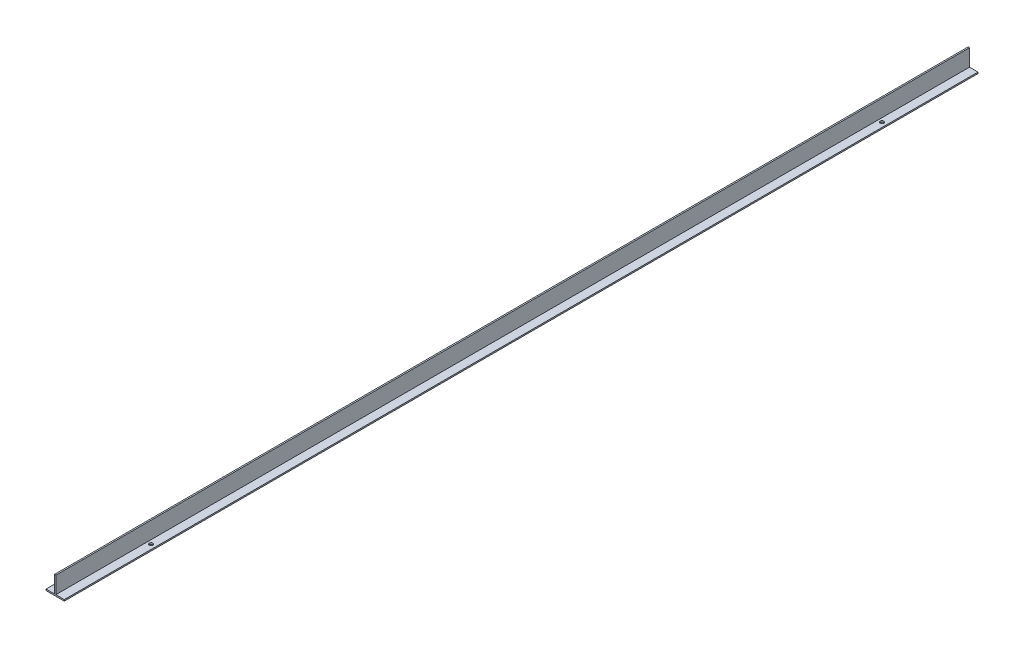
ISO-10303-21;
HEADER;
FILE_DESCRIPTION(('STEP AP214'),'2;1');
FILE_NAME('part.step','',(''),(''),'','','');
FILE_SCHEMA(('AUTOMOTIVE_DESIGN { 1 0 10303 214 1 1 1 1 }'));
ENDSEC;
DATA;
#1=APPLICATION_CONTEXT('core data for automotive mechanical design processes');
#2=APPLICATION_PROTOCOL_DEFINITION('international standard','automotive_design',2000,#1);
#3=PRODUCT_CONTEXT('',#1,'mechanical');
#4=PRODUCT('Part','Part','',(#3));
#5=PRODUCT_RELATED_PRODUCT_CATEGORY('part','',(#4));
#6=PRODUCT_DEFINITION_FORMATION('','',#4);
#7=PRODUCT_DEFINITION_CONTEXT('part definition',#1,'design');
#8=PRODUCT_DEFINITION('design','',#6,#7);
#9=PRODUCT_DEFINITION_SHAPE('','',#8);
#10=(LENGTH_UNIT() NAMED_UNIT(*) SI_UNIT(.MILLI.,.METRE.));
#11=(NAMED_UNIT(*) PLANE_ANGLE_UNIT() SI_UNIT($,.RADIAN.));
#12=(NAMED_UNIT(*) SI_UNIT($,.STERADIAN.) SOLID_ANGLE_UNIT());
#13=UNCERTAINTY_MEASURE_WITH_UNIT(LENGTH_MEASURE(1.E-05),#10,'distance_accuracy_value','');
#14=(GEOMETRIC_REPRESENTATION_CONTEXT(3) GLOBAL_UNCERTAINTY_ASSIGNED_CONTEXT((#13)) GLOBAL_UNIT_ASSIGNED_CONTEXT((#10,
#11,#12)) REPRESENTATION_CONTEXT('',''));
#15=CARTESIAN_POINT('',(0.,0.,0.));
#16=DIRECTION('',(0.,0.,1.));
#17=DIRECTION('',(1.,0.,0.));
#18=AXIS2_PLACEMENT_3D('',#15,#16,#17);
#19=CARTESIAN_POINT('',(10.,1.5,1000.));
#20=DIRECTION('',(-1.,0.,0.));
#21=DIRECTION('',(0.,0.,1.));
#22=AXIS2_PLACEMENT_3D('',#19,#20,#21);
#23=PLANE('',#22);
#24=DIRECTION('',(0.,1.,0.));
#25=VECTOR('',#24,1.);
#26=CARTESIAN_POINT('',(10.,1.5,0.));
#27=LINE('',#26,#25);
#28=CARTESIAN_POINT('',(10.,0.,0.));
#29=VERTEX_POINT('',#28);
#30=CARTESIAN_POINT('',(10.,1.5,0.));
#31=VERTEX_POINT('',#30);
#32=EDGE_CURVE('E132',#29,#31,#27,.T.);
#33=ORIENTED_EDGE('',*,*,#32,.T.);
#34=DIRECTION('',(0.,0.,-1.));
#35=VECTOR('',#34,1.);
#36=CARTESIAN_POINT('',(10.,1.5,1000.));
#37=LINE('',#36,#35);
#38=CARTESIAN_POINT('',(10.,1.5,1000.));
#39=VERTEX_POINT('',#38);
#40=EDGE_CURVE('E11',#39,#31,#37,.T.);
#41=ORIENTED_EDGE('',*,*,#40,.F.);
#42=DIRECTION('',(0.,1.,0.));
#43=VECTOR('',#42,1.);
#44=CARTESIAN_POINT('',(10.,1.5,1000.));
#45=LINE('',#44,#43);
#46=CARTESIAN_POINT('',(10.,0.,1000.));
#47=VERTEX_POINT('',#46);
#48=EDGE_CURVE('E147',#47,#39,#45,.T.);
#49=ORIENTED_EDGE('',*,*,#48,.F.);
#50=DIRECTION('',(0.,0.,-1.));
#51=VECTOR('',#50,1.);
#52=CARTESIAN_POINT('',(10.,0.,1000.));
#53=LINE('',#52,#51);
#54=EDGE_CURVE('E128',#47,#29,#53,.T.);
#55=ORIENTED_EDGE('',*,*,#54,.T.);
#56=EDGE_LOOP('',(#33,#41,#49,#55));
#57=FACE_BOUND('',#56,.T.);
#58=ADVANCED_FACE('F36',(#57),#23,.F.);
#59=CARTESIAN_POINT('',(0.749999999999998,1.5,1000.));
#60=DIRECTION('',(0.,-1.,0.));
#61=DIRECTION('',(1.,0.,0.));
#62=AXIS2_PLACEMENT_3D('',#59,#60,#61);
#63=PLANE('',#62);
#64=CARTESIAN_POINT('',(5.,1.5,100.));
#65=DIRECTION('',(0.,-1.,0.));
#66=DIRECTION('',(1.,0.,0.));
#67=AXIS2_PLACEMENT_3D('',#64,#65,#66);
#68=CIRCLE('',#67,2.00000000000001);
#69=CARTESIAN_POINT('',(7.,1.5,100.));
#70=VERTEX_POINT('',#69);
#71=EDGE_CURVE('E182',#70,#70,#68,.T.);
#72=ORIENTED_EDGE('',*,*,#71,.T.);
#73=EDGE_LOOP('',(#72));
#74=FACE_BOUND('',#73,.T.);
#75=CARTESIAN_POINT('',(5.,1.5,900.));
#76=DIRECTION('',(0.,-1.,0.));
#77=DIRECTION('',(1.,0.,0.));
#78=AXIS2_PLACEMENT_3D('',#75,#76,#77);
#79=CIRCLE('',#78,2.00000000000001);
#80=CARTESIAN_POINT('',(7.,1.5,900.));
#81=VERTEX_POINT('',#80);
#82=EDGE_CURVE('E188',#81,#81,#79,.T.);
#83=ORIENTED_EDGE('',*,*,#82,.T.);
#84=EDGE_LOOP('',(#83));
#85=FACE_BOUND('',#84,.T.);
#86=DIRECTION('',(-1.,0.,0.));
#87=VECTOR('',#86,1.);
#88=CARTESIAN_POINT('',(0.749999999999998,1.5,0.));
#89=LINE('',#88,#87);
#90=CARTESIAN_POINT('',(0.749999999999998,1.5,0.));
#91=VERTEX_POINT('',#90);
#92=EDGE_CURVE('E135',#31,#91,#89,.T.);
#93=ORIENTED_EDGE('',*,*,#92,.T.);
#94=DIRECTION('',(0.,0.,-1.));
#95=VECTOR('',#94,1.);
#96=CARTESIAN_POINT('',(0.749999999999998,1.5,1000.));
#97=LINE('',#96,#95);
#98=CARTESIAN_POINT('',(0.749999999999998,1.5,1000.));
#99=VERTEX_POINT('',#98);
#100=EDGE_CURVE('E44',#99,#91,#97,.T.);
#101=ORIENTED_EDGE('',*,*,#100,.F.);
#102=DIRECTION('',(-1.,0.,0.));
#103=VECTOR('',#102,1.);
#104=CARTESIAN_POINT('',(0.749999999999998,1.5,1000.));
#105=LINE('',#104,#103);
#106=EDGE_CURVE('E95',#39,#99,#105,.T.);
#107=ORIENTED_EDGE('',*,*,#106,.F.);
#108=ORIENTED_EDGE('',*,*,#40,.T.);
#109=EDGE_LOOP('',(#93,#101,#107,#108));
#110=FACE_BOUND('',#109,.T.);
#111=ADVANCED_FACE('F220',(#74,#85,#110),#63,.F.);
#112=CARTESIAN_POINT('',(0.75,20.,1000.));
#113=DIRECTION('',(-1.,0.,0.));
#114=DIRECTION('',(0.,-1.,0.));
#115=AXIS2_PLACEMENT_3D('',#112,#113,#114);
#116=PLANE('',#115);
#117=DIRECTION('',(0.,1.,0.));
#118=VECTOR('',#117,1.);
#119=CARTESIAN_POINT('',(0.75,20.,0.));
#120=LINE('',#119,#118);
#121=CARTESIAN_POINT('',(0.75,20.,0.));
#122=VERTEX_POINT('',#121);
#123=EDGE_CURVE('E138',#91,#122,#120,.T.);
#124=ORIENTED_EDGE('',*,*,#123,.T.);
#125=DIRECTION('',(0.,0.,-1.));
#126=VECTOR('',#125,1.);
#127=CARTESIAN_POINT('',(0.75,20.,1000.));
#128=LINE('',#127,#126);
#129=CARTESIAN_POINT('',(0.75,20.,1000.));
#130=VERTEX_POINT('',#129);
#131=EDGE_CURVE('E154',#130,#122,#128,.T.);
#132=ORIENTED_EDGE('',*,*,#131,.F.);
#133=DIRECTION('',(0.,1.,0.));
#134=VECTOR('',#133,1.);
#135=CARTESIAN_POINT('',(0.75,20.,1000.));
#136=LINE('',#135,#134);
#137=EDGE_CURVE('E162',#99,#130,#136,.T.);
#138=ORIENTED_EDGE('',*,*,#137,.F.);
#139=ORIENTED_EDGE('',*,*,#100,.T.);
#140=EDGE_LOOP('',(#124,#132,#138,#139));
#141=FACE_BOUND('',#140,.T.);
#142=ADVANCED_FACE('F160',(#141),#116,.F.);
#143=CARTESIAN_POINT('',(0.75,20.,1000.));
#144=DIRECTION('',(0.,-1.,0.));
#145=DIRECTION('',(0.,0.,-1.));
#146=AXIS2_PLACEMENT_3D('',#143,#144,#145);
#147=PLANE('',#146);
#148=DIRECTION('',(-1.,0.,0.));
#149=VECTOR('',#148,1.);
#150=CARTESIAN_POINT('',(0.75,20.,0.));
#151=LINE('',#150,#149);
#152=CARTESIAN_POINT('',(-0.75,20.,0.));
#153=VERTEX_POINT('',#152);
#154=EDGE_CURVE('E140',#122,#153,#151,.T.);
#155=ORIENTED_EDGE('',*,*,#154,.T.);
#156=DIRECTION('',(0.,0.,-1.));
#157=VECTOR('',#156,1.);
#158=CARTESIAN_POINT('',(-0.75,20.,1000.));
#159=LINE('',#158,#157);
#160=CARTESIAN_POINT('',(-0.75,20.,1000.));
#161=VERTEX_POINT('',#160);
#162=EDGE_CURVE('E151',#161,#153,#159,.T.);
#163=ORIENTED_EDGE('',*,*,#162,.F.);
#164=DIRECTION('',(-1.,0.,0.));
#165=VECTOR('',#164,1.);
#166=CARTESIAN_POINT('',(0.75,20.,1000.));
#167=LINE('',#166,#165);
#168=EDGE_CURVE('E174',#130,#161,#167,.T.);
#169=ORIENTED_EDGE('',*,*,#168,.F.);
#170=ORIENTED_EDGE('',*,*,#131,.T.);
#171=EDGE_LOOP('',(#155,#163,#169,#170));
#172=FACE_BOUND('',#171,.T.);
#173=ADVANCED_FACE('F170',(#172),#147,.F.);
#174=CARTESIAN_POINT('',(-0.75,20.,1000.));
#175=DIRECTION('',(1.,0.,0.));
#176=DIRECTION('',(0.,1.,0.));
#177=AXIS2_PLACEMENT_3D('',#174,#175,#176);
#178=PLANE('',#177);
#179=DIRECTION('',(0.,-1.,0.));
#180=VECTOR('',#179,1.);
#181=CARTESIAN_POINT('',(-0.75,20.,0.));
#182=LINE('',#181,#180);
#183=CARTESIAN_POINT('',(-0.749999999999998,1.5,0.));
#184=VERTEX_POINT('',#183);
#185=EDGE_CURVE('E142',#153,#184,#182,.T.);
#186=ORIENTED_EDGE('',*,*,#185,.T.);
#187=DIRECTION('',(0.,0.,-1.));
#188=VECTOR('',#187,1.);
#189=CARTESIAN_POINT('',(-0.749999999999998,1.5,1000.));
#190=LINE('',#189,#188);
#191=CARTESIAN_POINT('',(-0.749999999999998,1.5,1000.));
#192=VERTEX_POINT('',#191);
#193=EDGE_CURVE('E123',#192,#184,#190,.T.);
#194=ORIENTED_EDGE('',*,*,#193,.F.);
#195=DIRECTION('',(0.,-1.,0.));
#196=VECTOR('',#195,1.);
#197=CARTESIAN_POINT('',(-0.75,20.,1000.));
#198=LINE('',#197,#196);
#199=EDGE_CURVE('E114',#161,#192,#198,.T.);
#200=ORIENTED_EDGE('',*,*,#199,.F.);
#201=ORIENTED_EDGE('',*,*,#162,.T.);
#202=EDGE_LOOP('',(#186,#194,#200,#201));
#203=FACE_BOUND('',#202,.T.);
#204=ADVANCED_FACE('F173',(#203),#178,.F.);
#205=CARTESIAN_POINT('',(-0.749999999999998,1.5,1000.));
#206=DIRECTION('',(0.,-1.,0.));
#207=DIRECTION('',(1.,0.,0.));
#208=AXIS2_PLACEMENT_3D('',#205,#206,#207);
#209=PLANE('',#208);
#210=CARTESIAN_POINT('',(-5.,1.5,900.));
#211=DIRECTION('',(0.,-1.,0.));
#212=DIRECTION('',(1.,0.,0.));
#213=AXIS2_PLACEMENT_3D('',#210,#211,#212);
#214=CIRCLE('',#213,2.00000000000001);
#215=CARTESIAN_POINT('',(-2.99999999999999,1.5,900.));
#216=VERTEX_POINT('',#215);
#217=EDGE_CURVE('E136',#216,#216,#214,.T.);
#218=ORIENTED_EDGE('',*,*,#217,.T.);
#219=EDGE_LOOP('',(#218));
#220=FACE_BOUND('',#219,.T.);
#221=CARTESIAN_POINT('',(-5.,1.5,100.));
#222=DIRECTION('',(0.,-1.,0.));
#223=DIRECTION('',(1.,0.,0.));
#224=AXIS2_PLACEMENT_3D('',#221,#222,#223);
#225=CIRCLE('',#224,2.00000000000001);
#226=CARTESIAN_POINT('',(-2.99999999999999,1.5,100.));
#227=VERTEX_POINT('',#226);
#228=EDGE_CURVE('E185',#227,#227,#225,.T.);
#229=ORIENTED_EDGE('',*,*,#228,.T.);
#230=EDGE_LOOP('',(#229));
#231=FACE_BOUND('',#230,.T.);
#232=DIRECTION('',(-1.,0.,0.));
#233=VECTOR('',#232,1.);
#234=CARTESIAN_POINT('',(-0.749999999999998,1.5,0.));
#235=LINE('',#234,#233);
#236=CARTESIAN_POINT('',(-10.,1.5,0.));
#237=VERTEX_POINT('',#236);
#238=EDGE_CURVE('E122',#184,#237,#235,.T.);
#239=ORIENTED_EDGE('',*,*,#238,.T.);
#240=DIRECTION('',(0.,0.,-1.));
#241=VECTOR('',#240,1.);
#242=CARTESIAN_POINT('',(-10.,1.5,1000.));
#243=LINE('',#242,#241);
#244=CARTESIAN_POINT('',(-10.,1.5,1000.));
#245=VERTEX_POINT('',#244);
#246=EDGE_CURVE('E119',#245,#237,#243,.T.);
#247=ORIENTED_EDGE('',*,*,#246,.F.);
#248=DIRECTION('',(-1.,0.,0.));
#249=VECTOR('',#248,1.);
#250=CARTESIAN_POINT('',(-0.749999999999998,1.5,1000.));
#251=LINE('',#250,#249);
#252=EDGE_CURVE('E108',#192,#245,#251,.T.);
#253=ORIENTED_EDGE('',*,*,#252,.F.);
#254=ORIENTED_EDGE('',*,*,#193,.T.);
#255=EDGE_LOOP('',(#239,#247,#253,#254));
#256=FACE_BOUND('',#255,.T.);
#257=ADVANCED_FACE('F120',(#220,#231,#256),#209,.F.);
#258=CARTESIAN_POINT('',(-10.,1.5,1000.));
#259=DIRECTION('',(1.,0.,0.));
#260=DIRECTION('',(0.,0.,-1.));
#261=AXIS2_PLACEMENT_3D('',#258,#259,#260);
#262=PLANE('',#261);
#263=DIRECTION('',(0.,-1.,0.));
#264=VECTOR('',#263,1.);
#265=CARTESIAN_POINT('',(-10.,1.5,0.));
#266=LINE('',#265,#264);
#267=CARTESIAN_POINT('',(-10.,0.,0.));
#268=VERTEX_POINT('',#267);
#269=EDGE_CURVE('E81',#237,#268,#266,.T.);
#270=ORIENTED_EDGE('',*,*,#269,.T.);
#271=DIRECTION('',(0.,0.,-1.));
#272=VECTOR('',#271,1.);
#273=CARTESIAN_POINT('',(-10.,0.,1000.));
#274=LINE('',#273,#272);
#275=CARTESIAN_POINT('',(-10.,0.,1000.));
#276=VERTEX_POINT('',#275);
#277=EDGE_CURVE('E124',#276,#268,#274,.T.);
#278=ORIENTED_EDGE('',*,*,#277,.F.);
#279=DIRECTION('',(0.,-1.,0.));
#280=VECTOR('',#279,1.);
#281=CARTESIAN_POINT('',(-10.,1.5,1000.));
#282=LINE('',#281,#280);
#283=EDGE_CURVE('E112',#245,#276,#282,.T.);
#284=ORIENTED_EDGE('',*,*,#283,.F.);
#285=ORIENTED_EDGE('',*,*,#246,.T.);
#286=EDGE_LOOP('',(#270,#278,#284,#285));
#287=FACE_BOUND('',#286,.T.);
#288=ADVANCED_FACE('F126',(#287),#262,.F.);
#289=CARTESIAN_POINT('',(-10.,0.,1000.));
#290=DIRECTION('',(0.,1.,0.));
#291=DIRECTION('',(0.,0.,1.));
#292=AXIS2_PLACEMENT_3D('',#289,#290,#291);
#293=PLANE('',#292);
#294=CARTESIAN_POINT('',(-5.,0.,900.));
#295=DIRECTION('',(0.,-1.,0.));
#296=DIRECTION('',(0.,0.,-1.));
#297=AXIS2_PLACEMENT_3D('',#294,#295,#296);
#298=CIRCLE('',#297,2.00000000000001);
#299=CARTESIAN_POINT('',(-5.,0.,898.));
#300=VERTEX_POINT('',#299);
#301=EDGE_CURVE('E194',#300,#300,#298,.T.);
#302=ORIENTED_EDGE('',*,*,#301,.F.);
#303=EDGE_LOOP('',(#302));
#304=FACE_BOUND('',#303,.T.);
#305=CARTESIAN_POINT('',(5.,0.,100.));
#306=DIRECTION('',(0.,-1.,0.));
#307=DIRECTION('',(0.,0.,1.));
#308=AXIS2_PLACEMENT_3D('',#305,#306,#307);
#309=CIRCLE('',#308,2.00000000000001);
#310=CARTESIAN_POINT('',(5.,0.,102.));
#311=VERTEX_POINT('',#310);
#312=EDGE_CURVE('E195',#311,#311,#309,.T.);
#313=ORIENTED_EDGE('',*,*,#312,.F.);
#314=EDGE_LOOP('',(#313));
#315=FACE_BOUND('',#314,.T.);
#316=CARTESIAN_POINT('',(-5.,0.,100.));
#317=DIRECTION('',(0.,-1.,0.));
#318=DIRECTION('',(0.,0.,1.));
#319=AXIS2_PLACEMENT_3D('',#316,#317,#318);
#320=CIRCLE('',#319,2.00000000000001);
#321=CARTESIAN_POINT('',(-5.,0.,102.));
#322=VERTEX_POINT('',#321);
#323=EDGE_CURVE('E198',#322,#322,#320,.T.);
#324=ORIENTED_EDGE('',*,*,#323,.F.);
#325=EDGE_LOOP('',(#324));
#326=FACE_BOUND('',#325,.T.);
#327=CARTESIAN_POINT('',(5.,0.,900.));
#328=DIRECTION('',(0.,-1.,0.));
#329=DIRECTION('',(0.,0.,-1.));
#330=AXIS2_PLACEMENT_3D('',#327,#328,#329);
#331=CIRCLE('',#330,2.00000000000001);
#332=CARTESIAN_POINT('',(5.,0.,898.));
#333=VERTEX_POINT('',#332);
#334=EDGE_CURVE('E191',#333,#333,#331,.T.);
#335=ORIENTED_EDGE('',*,*,#334,.F.);
#336=EDGE_LOOP('',(#335));
#337=FACE_BOUND('',#336,.T.);
#338=DIRECTION('',(1.,0.,0.));
#339=VECTOR('',#338,1.);
#340=CARTESIAN_POINT('',(-10.,0.,0.));
#341=LINE('',#340,#339);
#342=EDGE_CURVE('E87',#268,#29,#341,.T.);
#343=ORIENTED_EDGE('',*,*,#342,.T.);
#344=ORIENTED_EDGE('',*,*,#54,.F.);
#345=DIRECTION('',(1.,0.,0.));
#346=VECTOR('',#345,1.);
#347=CARTESIAN_POINT('',(-10.,0.,1000.));
#348=LINE('',#347,#346);
#349=EDGE_CURVE('E52',#276,#47,#348,.T.);
#350=ORIENTED_EDGE('',*,*,#349,.F.);
#351=ORIENTED_EDGE('',*,*,#277,.T.);
#352=EDGE_LOOP('',(#343,#344,#350,#351));
#353=FACE_BOUND('',#352,.T.);
#354=ADVANCED_FACE('F207',(#304,#315,#326,#337,#353),#293,.F.);
#355=CARTESIAN_POINT('',(0.,0.,1000.));
#356=DIRECTION('',(0.,0.,1.));
#357=DIRECTION('',(1.,0.,0.));
#358=AXIS2_PLACEMENT_3D('',#355,#356,#357);
#359=PLANE('',#358);
#360=ORIENTED_EDGE('',*,*,#48,.T.);
#361=ORIENTED_EDGE('',*,*,#106,.T.);
#362=ORIENTED_EDGE('',*,*,#137,.T.);
#363=ORIENTED_EDGE('',*,*,#168,.T.);
#364=ORIENTED_EDGE('',*,*,#199,.T.);
#365=ORIENTED_EDGE('',*,*,#252,.T.);
#366=ORIENTED_EDGE('',*,*,#283,.T.);
#367=ORIENTED_EDGE('',*,*,#349,.T.);
#368=EDGE_LOOP('',(#360,#361,#362,#363,#364,#365,#366,#367));
#369=FACE_BOUND('',#368,.T.);
#370=ADVANCED_FACE('F110',(#369),#359,.T.);
#371=CARTESIAN_POINT('',(0.,0.,0.));
#372=DIRECTION('',(0.,0.,1.));
#373=DIRECTION('',(1.,0.,0.));
#374=AXIS2_PLACEMENT_3D('',#371,#372,#373);
#375=PLANE('',#374);
#376=ORIENTED_EDGE('',*,*,#32,.F.);
#377=ORIENTED_EDGE('',*,*,#342,.F.);
#378=ORIENTED_EDGE('',*,*,#269,.F.);
#379=ORIENTED_EDGE('',*,*,#238,.F.);
#380=ORIENTED_EDGE('',*,*,#185,.F.);
#381=ORIENTED_EDGE('',*,*,#154,.F.);
#382=ORIENTED_EDGE('',*,*,#123,.F.);
#383=ORIENTED_EDGE('',*,*,#92,.F.);
#384=EDGE_LOOP('',(#376,#377,#378,#379,#380,#381,#382,#383));
#385=FACE_BOUND('',#384,.T.);
#386=ADVANCED_FACE('F166',(#385),#375,.F.);
#387=CARTESIAN_POINT('',(5.,10.,900.));
#388=DIRECTION('',(0.,-1.,0.));
#389=DIRECTION('',(0.,0.,-1.));
#390=AXIS2_PLACEMENT_3D('',#387,#388,#389);
#391=CYLINDRICAL_SURFACE('',#390,2.00000000000001);
#392=ORIENTED_EDGE('',*,*,#334,.T.);
#393=EDGE_LOOP('',(#392));
#394=FACE_BOUND('',#393,.T.);
#395=ORIENTED_EDGE('',*,*,#82,.F.);
#396=EDGE_LOOP('',(#395));
#397=FACE_BOUND('',#396,.T.);
#398=ADVANCED_FACE('F214',(#394,#397),#391,.F.);
#399=CARTESIAN_POINT('',(-5.,10.,100.));
#400=DIRECTION('',(0.,-1.,0.));
#401=DIRECTION('',(0.,0.,-1.));
#402=AXIS2_PLACEMENT_3D('',#399,#400,#401);
#403=CYLINDRICAL_SURFACE('',#402,2.00000000000001);
#404=ORIENTED_EDGE('',*,*,#323,.T.);
#405=EDGE_LOOP('',(#404));
#406=FACE_BOUND('',#405,.T.);
#407=ORIENTED_EDGE('',*,*,#228,.F.);
#408=EDGE_LOOP('',(#407));
#409=FACE_BOUND('',#408,.T.);
#410=ADVANCED_FACE('F204',(#406,#409),#403,.F.);
#411=CARTESIAN_POINT('',(5.,10.,100.));
#412=DIRECTION('',(0.,-1.,0.));
#413=DIRECTION('',(0.,0.,-1.));
#414=AXIS2_PLACEMENT_3D('',#411,#412,#413);
#415=CYLINDRICAL_SURFACE('',#414,2.00000000000001);
#416=ORIENTED_EDGE('',*,*,#312,.T.);
#417=EDGE_LOOP('',(#416));
#418=FACE_BOUND('',#417,.T.);
#419=ORIENTED_EDGE('',*,*,#71,.F.);
#420=EDGE_LOOP('',(#419));
#421=FACE_BOUND('',#420,.T.);
#422=ADVANCED_FACE('F290',(#418,#421),#415,.F.);
#423=CARTESIAN_POINT('',(-5.,10.,900.));
#424=DIRECTION('',(0.,-1.,0.));
#425=DIRECTION('',(0.,0.,-1.));
#426=AXIS2_PLACEMENT_3D('',#423,#424,#425);
#427=CYLINDRICAL_SURFACE('',#426,2.00000000000001);
#428=ORIENTED_EDGE('',*,*,#301,.T.);
#429=EDGE_LOOP('',(#428));
#430=FACE_BOUND('',#429,.T.);
#431=ORIENTED_EDGE('',*,*,#217,.F.);
#432=EDGE_LOOP('',(#431));
#433=FACE_BOUND('',#432,.T.);
#434=ADVANCED_FACE('F297',(#430,#433),#427,.F.);
#435=CLOSED_SHELL('',(#58,#111,#142,#173,#204,#257,#288,#354,#370,#386,#398,#410,#422,#434));
#436=MANIFOLD_SOLID_BREP('B2',#435);
#437=ADVANCED_BREP_SHAPE_REPRESENTATION('',(#18,#436),#14);
#438=SHAPE_DEFINITION_REPRESENTATION(#9,#437);
ENDSEC;
END-ISO-10303-21;
